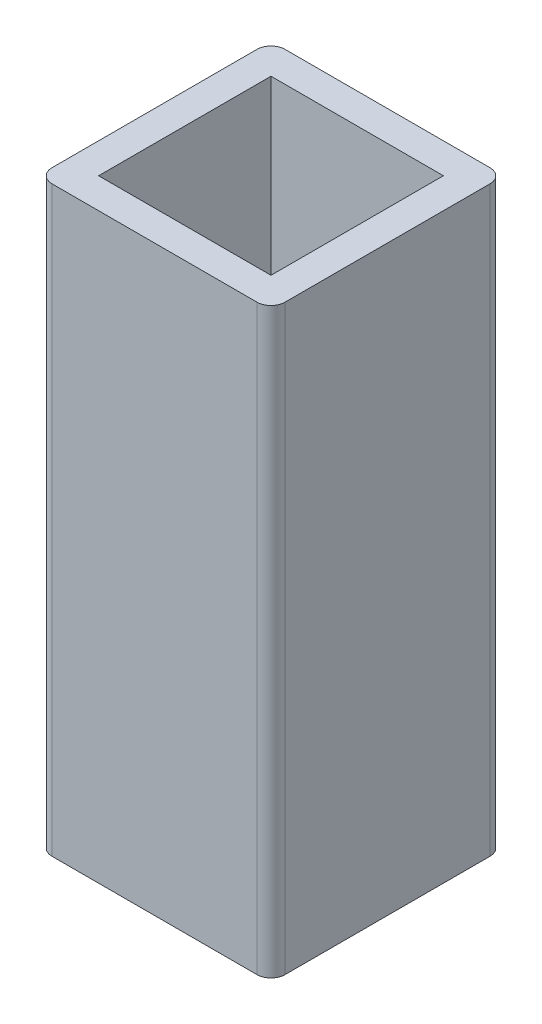
ISO-10303-21;
HEADER;
FILE_DESCRIPTION(('STEP AP214'),'2;1');
FILE_NAME('part.step','',(''),(''),'','','');
FILE_SCHEMA(('AUTOMOTIVE_DESIGN { 1 0 10303 214 1 1 1 1 }'));
ENDSEC;
DATA;
#1=APPLICATION_CONTEXT('core data for automotive mechanical design processes');
#2=APPLICATION_PROTOCOL_DEFINITION('international standard','automotive_design',2000,#1);
#3=PRODUCT_CONTEXT('',#1,'mechanical');
#4=PRODUCT('Part','Part','',(#3));
#5=PRODUCT_RELATED_PRODUCT_CATEGORY('part','',(#4));
#6=PRODUCT_DEFINITION_FORMATION('','',#4);
#7=PRODUCT_DEFINITION_CONTEXT('part definition',#1,'design');
#8=PRODUCT_DEFINITION('design','',#6,#7);
#9=PRODUCT_DEFINITION_SHAPE('','',#8);
#10=(LENGTH_UNIT() NAMED_UNIT(*) SI_UNIT(.MILLI.,.METRE.));
#11=(NAMED_UNIT(*) PLANE_ANGLE_UNIT() SI_UNIT($,.RADIAN.));
#12=(NAMED_UNIT(*) SI_UNIT($,.STERADIAN.) SOLID_ANGLE_UNIT());
#13=UNCERTAINTY_MEASURE_WITH_UNIT(LENGTH_MEASURE(1.E-05),#10,'distance_accuracy_value','');
#14=(GEOMETRIC_REPRESENTATION_CONTEXT(3) GLOBAL_UNCERTAINTY_ASSIGNED_CONTEXT((#13)) GLOBAL_UNIT_ASSIGNED_CONTEXT((#10,
#11,#12)) REPRESENTATION_CONTEXT('',''));
#15=CARTESIAN_POINT('',(0.,0.,0.));
#16=DIRECTION('',(0.,0.,1.));
#17=DIRECTION('',(1.,0.,0.));
#18=AXIS2_PLACEMENT_3D('',#15,#16,#17);
#19=CARTESIAN_POINT('',(-5.588,31.75,5.588));
#20=DIRECTION('',(0.,-1.,0.));
#21=DIRECTION('',(0.,0.,-1.));
#22=AXIS2_PLACEMENT_3D('',#19,#20,#21);
#23=PLANE('',#22);
#24=CARTESIAN_POINT('',(-5.588,31.75,5.588));
#25=DIRECTION('',(0.,1.,0.));
#26=DIRECTION('',(0.,0.,-1.));
#27=AXIS2_PLACEMENT_3D('',#24,#25,#26);
#28=CIRCLE('',#27,0.761999999999999);
#29=CARTESIAN_POINT('',(-6.35,31.75,5.588));
#30=VERTEX_POINT('',#29);
#31=CARTESIAN_POINT('',(-5.588,31.75,6.35));
#32=VERTEX_POINT('',#31);
#33=EDGE_CURVE('E168',#30,#32,#28,.T.);
#34=ORIENTED_EDGE('',*,*,#33,.T.);
#35=DIRECTION('',(1.,0.,0.));
#36=VECTOR('',#35,1.);
#37=CARTESIAN_POINT('',(-5.588,31.75,6.35));
#38=LINE('',#37,#36);
#39=CARTESIAN_POINT('',(5.588,31.75,6.35));
#40=VERTEX_POINT('',#39);
#41=EDGE_CURVE('E171',#32,#40,#38,.T.);
#42=ORIENTED_EDGE('',*,*,#41,.T.);
#43=CARTESIAN_POINT('',(5.588,31.75,5.588));
#44=DIRECTION('',(0.,1.,0.));
#45=DIRECTION('',(0.,0.,1.));
#46=AXIS2_PLACEMENT_3D('',#43,#44,#45);
#47=CIRCLE('',#46,0.761999999999999);
#48=CARTESIAN_POINT('',(6.35,31.75,5.588));
#49=VERTEX_POINT('',#48);
#50=EDGE_CURVE('E174',#40,#49,#47,.T.);
#51=ORIENTED_EDGE('',*,*,#50,.T.);
#52=DIRECTION('',(0.,0.,-1.));
#53=VECTOR('',#52,1.);
#54=CARTESIAN_POINT('',(6.35,31.75,5.588));
#55=LINE('',#54,#53);
#56=CARTESIAN_POINT('',(6.35,31.75,-5.588));
#57=VERTEX_POINT('',#56);
#58=EDGE_CURVE('E176',#49,#57,#55,.T.);
#59=ORIENTED_EDGE('',*,*,#58,.T.);
#60=CARTESIAN_POINT('',(5.588,31.75,-5.588));
#61=DIRECTION('',(0.,1.,0.));
#62=DIRECTION('',(0.,0.,-1.));
#63=AXIS2_PLACEMENT_3D('',#60,#61,#62);
#64=CIRCLE('',#63,0.761999999999999);
#65=CARTESIAN_POINT('',(5.588,31.75,-6.35));
#66=VERTEX_POINT('',#65);
#67=EDGE_CURVE('E178',#57,#66,#64,.T.);
#68=ORIENTED_EDGE('',*,*,#67,.T.);
#69=DIRECTION('',(-1.,0.,0.));
#70=VECTOR('',#69,1.);
#71=CARTESIAN_POINT('',(-5.588,31.75,-6.35));
#72=LINE('',#71,#70);
#73=CARTESIAN_POINT('',(-5.588,31.75,-6.35));
#74=VERTEX_POINT('',#73);
#75=EDGE_CURVE('E180',#66,#74,#72,.T.);
#76=ORIENTED_EDGE('',*,*,#75,.T.);
#77=CARTESIAN_POINT('',(-5.588,31.75,-5.588));
#78=DIRECTION('',(0.,1.,0.));
#79=DIRECTION('',(0.,0.,-1.));
#80=AXIS2_PLACEMENT_3D('',#77,#78,#79);
#81=CIRCLE('',#80,0.762000000000001);
#82=CARTESIAN_POINT('',(-6.35,31.75,-5.588));
#83=VERTEX_POINT('',#82);
#84=EDGE_CURVE('E182',#74,#83,#81,.T.);
#85=ORIENTED_EDGE('',*,*,#84,.T.);
#86=DIRECTION('',(0.,0.,1.));
#87=VECTOR('',#86,1.);
#88=CARTESIAN_POINT('',(-6.35,31.75,5.588));
#89=LINE('',#88,#87);
#90=EDGE_CURVE('E184',#83,#30,#89,.T.);
#91=ORIENTED_EDGE('',*,*,#90,.T.);
#92=EDGE_LOOP('',(#34,#42,#51,#59,#68,#76,#85,#91));
#93=FACE_BOUND('',#92,.T.);
#94=DIRECTION('',(1.,0.,0.));
#95=VECTOR('',#94,1.);
#96=CARTESIAN_POINT('',(-4.699,31.75,4.699));
#97=LINE('',#96,#95);
#98=CARTESIAN_POINT('',(-4.699,31.75,4.699));
#99=VERTEX_POINT('',#98);
#100=CARTESIAN_POINT('',(4.699,31.75,4.699));
#101=VERTEX_POINT('',#100);
#102=EDGE_CURVE('E132',#99,#101,#97,.T.);
#103=ORIENTED_EDGE('',*,*,#102,.F.);
#104=DIRECTION('',(0.,0.,1.));
#105=VECTOR('',#104,1.);
#106=CARTESIAN_POINT('',(-4.699,31.75,4.699));
#107=LINE('',#106,#105);
#108=CARTESIAN_POINT('',(-4.699,31.75,-4.699));
#109=VERTEX_POINT('',#108);
#110=EDGE_CURVE('E154',#109,#99,#107,.T.);
#111=ORIENTED_EDGE('',*,*,#110,.F.);
#112=DIRECTION('',(-1.,0.,0.));
#113=VECTOR('',#112,1.);
#114=CARTESIAN_POINT('',(-4.699,31.75,-4.699));
#115=LINE('',#114,#113);
#116=CARTESIAN_POINT('',(4.699,31.75,-4.699));
#117=VERTEX_POINT('',#116);
#118=EDGE_CURVE('E152',#117,#109,#115,.T.);
#119=ORIENTED_EDGE('',*,*,#118,.F.);
#120=DIRECTION('',(0.,0.,-1.));
#121=VECTOR('',#120,1.);
#122=CARTESIAN_POINT('',(4.699,31.75,4.699));
#123=LINE('',#122,#121);
#124=EDGE_CURVE('E140',#101,#117,#123,.T.);
#125=ORIENTED_EDGE('',*,*,#124,.F.);
#126=EDGE_LOOP('',(#103,#111,#119,#125));
#127=FACE_BOUND('',#126,.T.);
#128=ADVANCED_FACE('F43',(#93,#127),#23,.F.);
#129=CARTESIAN_POINT('',(-5.588,0.,5.588));
#130=DIRECTION('',(0.,-1.,0.));
#131=DIRECTION('',(0.,0.,-1.));
#132=AXIS2_PLACEMENT_3D('',#129,#130,#131);
#133=PLANE('',#132);
#134=CARTESIAN_POINT('',(-5.588,0.,5.588));
#135=DIRECTION('',(0.,1.,0.));
#136=DIRECTION('',(0.,0.,-1.));
#137=AXIS2_PLACEMENT_3D('',#134,#135,#136);
#138=CIRCLE('',#137,0.761999999999999);
#139=CARTESIAN_POINT('',(-6.35,0.,5.588));
#140=VERTEX_POINT('',#139);
#141=CARTESIAN_POINT('',(-5.588,0.,6.35));
#142=VERTEX_POINT('',#141);
#143=EDGE_CURVE('E148',#140,#142,#138,.T.);
#144=ORIENTED_EDGE('',*,*,#143,.F.);
#145=DIRECTION('',(0.,0.,1.));
#146=VECTOR('',#145,1.);
#147=CARTESIAN_POINT('',(-6.35,0.,5.588));
#148=LINE('',#147,#146);
#149=CARTESIAN_POINT('',(-6.35,0.,-5.588));
#150=VERTEX_POINT('',#149);
#151=EDGE_CURVE('E172',#150,#140,#148,.T.);
#152=ORIENTED_EDGE('',*,*,#151,.F.);
#153=CARTESIAN_POINT('',(-5.588,0.,-5.588));
#154=DIRECTION('',(0.,1.,0.));
#155=DIRECTION('',(0.,0.,-1.));
#156=AXIS2_PLACEMENT_3D('',#153,#154,#155);
#157=CIRCLE('',#156,0.762000000000001);
#158=CARTESIAN_POINT('',(-5.588,0.,-6.35));
#159=VERTEX_POINT('',#158);
#160=EDGE_CURVE('E199',#159,#150,#157,.T.);
#161=ORIENTED_EDGE('',*,*,#160,.F.);
#162=DIRECTION('',(-1.,0.,0.));
#163=VECTOR('',#162,1.);
#164=CARTESIAN_POINT('',(-5.588,0.,-6.35));
#165=LINE('',#164,#163);
#166=CARTESIAN_POINT('',(5.588,0.,-6.35));
#167=VERTEX_POINT('',#166);
#168=EDGE_CURVE('E197',#167,#159,#165,.T.);
#169=ORIENTED_EDGE('',*,*,#168,.F.);
#170=CARTESIAN_POINT('',(5.588,0.,-5.588));
#171=DIRECTION('',(0.,1.,0.));
#172=DIRECTION('',(0.,0.,-1.));
#173=AXIS2_PLACEMENT_3D('',#170,#171,#172);
#174=CIRCLE('',#173,0.761999999999999);
#175=CARTESIAN_POINT('',(6.35,0.,-5.588));
#176=VERTEX_POINT('',#175);
#177=EDGE_CURVE('E195',#176,#167,#174,.T.);
#178=ORIENTED_EDGE('',*,*,#177,.F.);
#179=DIRECTION('',(0.,0.,-1.));
#180=VECTOR('',#179,1.);
#181=CARTESIAN_POINT('',(6.35,0.,5.588));
#182=LINE('',#181,#180);
#183=CARTESIAN_POINT('',(6.35,0.,5.588));
#184=VERTEX_POINT('',#183);
#185=EDGE_CURVE('E193',#184,#176,#182,.T.);
#186=ORIENTED_EDGE('',*,*,#185,.F.);
#187=CARTESIAN_POINT('',(5.588,0.,5.588));
#188=DIRECTION('',(0.,1.,0.));
#189=DIRECTION('',(0.,0.,1.));
#190=AXIS2_PLACEMENT_3D('',#187,#188,#189);
#191=CIRCLE('',#190,0.761999999999999);
#192=CARTESIAN_POINT('',(5.588,0.,6.35));
#193=VERTEX_POINT('',#192);
#194=EDGE_CURVE('E191',#193,#184,#191,.T.);
#195=ORIENTED_EDGE('',*,*,#194,.F.);
#196=DIRECTION('',(1.,0.,0.));
#197=VECTOR('',#196,1.);
#198=CARTESIAN_POINT('',(-5.588,0.,6.35));
#199=LINE('',#198,#197);
#200=EDGE_CURVE('E189',#142,#193,#199,.T.);
#201=ORIENTED_EDGE('',*,*,#200,.F.);
#202=EDGE_LOOP('',(#144,#152,#161,#169,#178,#186,#195,#201));
#203=FACE_BOUND('',#202,.T.);
#204=DIRECTION('',(0.,0.,1.));
#205=VECTOR('',#204,1.);
#206=CARTESIAN_POINT('',(-4.699,0.,4.699));
#207=LINE('',#206,#205);
#208=CARTESIAN_POINT('',(-4.699,0.,-4.699));
#209=VERTEX_POINT('',#208);
#210=CARTESIAN_POINT('',(-4.699,0.,4.699));
#211=VERTEX_POINT('',#210);
#212=EDGE_CURVE('E141',#209,#211,#207,.T.);
#213=ORIENTED_EDGE('',*,*,#212,.T.);
#214=DIRECTION('',(1.,0.,0.));
#215=VECTOR('',#214,1.);
#216=CARTESIAN_POINT('',(-4.699,0.,4.699));
#217=LINE('',#216,#215);
#218=CARTESIAN_POINT('',(4.699,0.,4.699));
#219=VERTEX_POINT('',#218);
#220=EDGE_CURVE('E66',#211,#219,#217,.T.);
#221=ORIENTED_EDGE('',*,*,#220,.T.);
#222=DIRECTION('',(0.,0.,-1.));
#223=VECTOR('',#222,1.);
#224=CARTESIAN_POINT('',(4.699,0.,4.699));
#225=LINE('',#224,#223);
#226=CARTESIAN_POINT('',(4.699,0.,-4.699));
#227=VERTEX_POINT('',#226);
#228=EDGE_CURVE('E147',#219,#227,#225,.T.);
#229=ORIENTED_EDGE('',*,*,#228,.T.);
#230=DIRECTION('',(-1.,0.,0.));
#231=VECTOR('',#230,1.);
#232=CARTESIAN_POINT('',(-4.699,0.,-4.699));
#233=LINE('',#232,#231);
#234=EDGE_CURVE('E160',#227,#209,#233,.T.);
#235=ORIENTED_EDGE('',*,*,#234,.T.);
#236=EDGE_LOOP('',(#213,#221,#229,#235));
#237=FACE_BOUND('',#236,.T.);
#238=ADVANCED_FACE('F229',(#203,#237),#133,.T.);
#239=CARTESIAN_POINT('',(-5.588,31.75,5.588));
#240=DIRECTION('',(0.,-1.,0.));
#241=DIRECTION('',(0.,0.,-1.));
#242=AXIS2_PLACEMENT_3D('',#239,#240,#241);
#243=CYLINDRICAL_SURFACE('',#242,0.761999999999999);
#244=ORIENTED_EDGE('',*,*,#143,.T.);
#245=DIRECTION('',(0.,-1.,0.));
#246=VECTOR('',#245,1.);
#247=CARTESIAN_POINT('',(-5.588,31.75,6.35));
#248=LINE('',#247,#246);
#249=EDGE_CURVE('E11',#32,#142,#248,.T.);
#250=ORIENTED_EDGE('',*,*,#249,.F.);
#251=ORIENTED_EDGE('',*,*,#33,.F.);
#252=DIRECTION('',(0.,-1.,0.));
#253=VECTOR('',#252,1.);
#254=CARTESIAN_POINT('',(-6.35,31.75,5.588));
#255=LINE('',#254,#253);
#256=EDGE_CURVE('E186',#30,#140,#255,.T.);
#257=ORIENTED_EDGE('',*,*,#256,.T.);
#258=EDGE_LOOP('',(#244,#250,#251,#257));
#259=FACE_BOUND('',#258,.T.);
#260=ADVANCED_FACE('F45',(#259),#243,.T.);
#261=CARTESIAN_POINT('',(-5.588,31.75,6.35));
#262=DIRECTION('',(0.,0.,-1.));
#263=DIRECTION('',(-1.,0.,0.));
#264=AXIS2_PLACEMENT_3D('',#261,#262,#263);
#265=PLANE('',#264);
#266=ORIENTED_EDGE('',*,*,#200,.T.);
#267=DIRECTION('',(0.,-1.,0.));
#268=VECTOR('',#267,1.);
#269=CARTESIAN_POINT('',(5.588,31.75,6.35));
#270=LINE('',#269,#268);
#271=EDGE_CURVE('E51',#40,#193,#270,.T.);
#272=ORIENTED_EDGE('',*,*,#271,.F.);
#273=ORIENTED_EDGE('',*,*,#41,.F.);
#274=ORIENTED_EDGE('',*,*,#249,.T.);
#275=EDGE_LOOP('',(#266,#272,#273,#274));
#276=FACE_BOUND('',#275,.T.);
#277=ADVANCED_FACE('F246',(#276),#265,.F.);
#278=CARTESIAN_POINT('',(5.588,31.75,5.588));
#279=DIRECTION('',(0.,-1.,0.));
#280=DIRECTION('',(0.,0.,-1.));
#281=AXIS2_PLACEMENT_3D('',#278,#279,#280);
#282=CYLINDRICAL_SURFACE('',#281,0.761999999999999);
#283=ORIENTED_EDGE('',*,*,#194,.T.);
#284=DIRECTION('',(0.,-1.,0.));
#285=VECTOR('',#284,1.);
#286=CARTESIAN_POINT('',(6.35,31.75,5.588));
#287=LINE('',#286,#285);
#288=EDGE_CURVE('E216',#49,#184,#287,.T.);
#289=ORIENTED_EDGE('',*,*,#288,.F.);
#290=ORIENTED_EDGE('',*,*,#50,.F.);
#291=ORIENTED_EDGE('',*,*,#271,.T.);
#292=EDGE_LOOP('',(#283,#289,#290,#291));
#293=FACE_BOUND('',#292,.T.);
#294=ADVANCED_FACE('F223',(#293),#282,.T.);
#295=CARTESIAN_POINT('',(6.35,31.75,5.588));
#296=DIRECTION('',(-1.,0.,0.));
#297=DIRECTION('',(0.,0.,1.));
#298=AXIS2_PLACEMENT_3D('',#295,#296,#297);
#299=PLANE('',#298);
#300=ORIENTED_EDGE('',*,*,#185,.T.);
#301=DIRECTION('',(0.,-1.,0.));
#302=VECTOR('',#301,1.);
#303=CARTESIAN_POINT('',(6.35,31.75,-5.588));
#304=LINE('',#303,#302);
#305=EDGE_CURVE('E213',#57,#176,#304,.T.);
#306=ORIENTED_EDGE('',*,*,#305,.F.);
#307=ORIENTED_EDGE('',*,*,#58,.F.);
#308=ORIENTED_EDGE('',*,*,#288,.T.);
#309=EDGE_LOOP('',(#300,#306,#307,#308));
#310=FACE_BOUND('',#309,.T.);
#311=ADVANCED_FACE('F235',(#310),#299,.F.);
#312=CARTESIAN_POINT('',(5.588,31.75,-5.588));
#313=DIRECTION('',(0.,-1.,0.));
#314=DIRECTION('',(0.,0.,-1.));
#315=AXIS2_PLACEMENT_3D('',#312,#313,#314);
#316=CYLINDRICAL_SURFACE('',#315,0.761999999999999);
#317=ORIENTED_EDGE('',*,*,#177,.T.);
#318=DIRECTION('',(0.,-1.,0.));
#319=VECTOR('',#318,1.);
#320=CARTESIAN_POINT('',(5.588,31.75,-6.35));
#321=LINE('',#320,#319);
#322=EDGE_CURVE('E210',#66,#167,#321,.T.);
#323=ORIENTED_EDGE('',*,*,#322,.F.);
#324=ORIENTED_EDGE('',*,*,#67,.F.);
#325=ORIENTED_EDGE('',*,*,#305,.T.);
#326=EDGE_LOOP('',(#317,#323,#324,#325));
#327=FACE_BOUND('',#326,.T.);
#328=ADVANCED_FACE('F239',(#327),#316,.T.);
#329=CARTESIAN_POINT('',(-5.588,31.75,-6.35));
#330=DIRECTION('',(0.,0.,1.));
#331=DIRECTION('',(1.,0.,0.));
#332=AXIS2_PLACEMENT_3D('',#329,#330,#331);
#333=PLANE('',#332);
#334=ORIENTED_EDGE('',*,*,#168,.T.);
#335=DIRECTION('',(0.,-1.,0.));
#336=VECTOR('',#335,1.);
#337=CARTESIAN_POINT('',(-5.588,31.75,-6.35));
#338=LINE('',#337,#336);
#339=EDGE_CURVE('E207',#74,#159,#338,.T.);
#340=ORIENTED_EDGE('',*,*,#339,.F.);
#341=ORIENTED_EDGE('',*,*,#75,.F.);
#342=ORIENTED_EDGE('',*,*,#322,.T.);
#343=EDGE_LOOP('',(#334,#340,#341,#342));
#344=FACE_BOUND('',#343,.T.);
#345=ADVANCED_FACE('F259',(#344),#333,.F.);
#346=CARTESIAN_POINT('',(-5.588,31.75,-5.588));
#347=DIRECTION('',(0.,-1.,0.));
#348=DIRECTION('',(0.,0.,-1.));
#349=AXIS2_PLACEMENT_3D('',#346,#347,#348);
#350=CYLINDRICAL_SURFACE('',#349,0.762000000000001);
#351=ORIENTED_EDGE('',*,*,#160,.T.);
#352=DIRECTION('',(0.,-1.,0.));
#353=VECTOR('',#352,1.);
#354=CARTESIAN_POINT('',(-6.35,31.75,-5.588));
#355=LINE('',#354,#353);
#356=EDGE_CURVE('E204',#83,#150,#355,.T.);
#357=ORIENTED_EDGE('',*,*,#356,.F.);
#358=ORIENTED_EDGE('',*,*,#84,.F.);
#359=ORIENTED_EDGE('',*,*,#339,.T.);
#360=EDGE_LOOP('',(#351,#357,#358,#359));
#361=FACE_BOUND('',#360,.T.);
#362=ADVANCED_FACE('F257',(#361),#350,.T.);
#363=CARTESIAN_POINT('',(-6.35,31.75,5.588));
#364=DIRECTION('',(1.,0.,0.));
#365=DIRECTION('',(0.,0.,-1.));
#366=AXIS2_PLACEMENT_3D('',#363,#364,#365);
#367=PLANE('',#366);
#368=ORIENTED_EDGE('',*,*,#151,.T.);
#369=ORIENTED_EDGE('',*,*,#256,.F.);
#370=ORIENTED_EDGE('',*,*,#90,.F.);
#371=ORIENTED_EDGE('',*,*,#356,.T.);
#372=EDGE_LOOP('',(#368,#369,#370,#371));
#373=FACE_BOUND('',#372,.T.);
#374=ADVANCED_FACE('F252',(#373),#367,.F.);
#375=CARTESIAN_POINT('',(-4.699,31.75,4.699));
#376=DIRECTION('',(0.,0.,-1.));
#377=DIRECTION('',(-1.,0.,0.));
#378=AXIS2_PLACEMENT_3D('',#375,#376,#377);
#379=PLANE('',#378);
#380=ORIENTED_EDGE('',*,*,#220,.F.);
#381=DIRECTION('',(0.,-1.,0.));
#382=VECTOR('',#381,1.);
#383=CARTESIAN_POINT('',(-4.699,31.75,4.699));
#384=LINE('',#383,#382);
#385=EDGE_CURVE('E136',#99,#211,#384,.T.);
#386=ORIENTED_EDGE('',*,*,#385,.F.);
#387=ORIENTED_EDGE('',*,*,#102,.T.);
#388=DIRECTION('',(0.,-1.,0.));
#389=VECTOR('',#388,1.);
#390=CARTESIAN_POINT('',(4.699,31.75,4.699));
#391=LINE('',#390,#389);
#392=EDGE_CURVE('E135',#101,#219,#391,.T.);
#393=ORIENTED_EDGE('',*,*,#392,.T.);
#394=EDGE_LOOP('',(#380,#386,#387,#393));
#395=FACE_BOUND('',#394,.T.);
#396=ADVANCED_FACE('F134',(#395),#379,.T.);
#397=CARTESIAN_POINT('',(4.699,31.75,4.699));
#398=DIRECTION('',(-1.,0.,0.));
#399=DIRECTION('',(0.,0.,1.));
#400=AXIS2_PLACEMENT_3D('',#397,#398,#399);
#401=PLANE('',#400);
#402=ORIENTED_EDGE('',*,*,#228,.F.);
#403=ORIENTED_EDGE('',*,*,#392,.F.);
#404=ORIENTED_EDGE('',*,*,#124,.T.);
#405=DIRECTION('',(0.,-1.,0.));
#406=VECTOR('',#405,1.);
#407=CARTESIAN_POINT('',(4.699,31.75,-4.699));
#408=LINE('',#407,#406);
#409=EDGE_CURVE('E149',#117,#227,#408,.T.);
#410=ORIENTED_EDGE('',*,*,#409,.T.);
#411=EDGE_LOOP('',(#402,#403,#404,#410));
#412=FACE_BOUND('',#411,.T.);
#413=ADVANCED_FACE('F144',(#412),#401,.T.);
#414=CARTESIAN_POINT('',(-4.699,31.75,-4.699));
#415=DIRECTION('',(0.,0.,1.));
#416=DIRECTION('',(1.,0.,0.));
#417=AXIS2_PLACEMENT_3D('',#414,#415,#416);
#418=PLANE('',#417);
#419=ORIENTED_EDGE('',*,*,#234,.F.);
#420=ORIENTED_EDGE('',*,*,#409,.F.);
#421=ORIENTED_EDGE('',*,*,#118,.T.);
#422=DIRECTION('',(0.,-1.,0.));
#423=VECTOR('',#422,1.);
#424=CARTESIAN_POINT('',(-4.699,31.75,-4.699));
#425=LINE('',#424,#423);
#426=EDGE_CURVE('E58',#109,#209,#425,.T.);
#427=ORIENTED_EDGE('',*,*,#426,.T.);
#428=EDGE_LOOP('',(#419,#420,#421,#427));
#429=FACE_BOUND('',#428,.T.);
#430=ADVANCED_FACE('F284',(#429),#418,.T.);
#431=CARTESIAN_POINT('',(-4.699,31.75,4.699));
#432=DIRECTION('',(1.,0.,0.));
#433=DIRECTION('',(0.,0.,-1.));
#434=AXIS2_PLACEMENT_3D('',#431,#432,#433);
#435=PLANE('',#434);
#436=ORIENTED_EDGE('',*,*,#212,.F.);
#437=ORIENTED_EDGE('',*,*,#426,.F.);
#438=ORIENTED_EDGE('',*,*,#110,.T.);
#439=ORIENTED_EDGE('',*,*,#385,.T.);
#440=EDGE_LOOP('',(#436,#437,#438,#439));
#441=FACE_BOUND('',#440,.T.);
#442=ADVANCED_FACE('F288',(#441),#435,.T.);
#443=CLOSED_SHELL('',(#128,#238,#260,#277,#294,#311,#328,#345,#362,#374,#396,#413,#430,#442));
#444=MANIFOLD_SOLID_BREP('B2',#443);
#445=ADVANCED_BREP_SHAPE_REPRESENTATION('',(#18,#444),#14);
#446=SHAPE_DEFINITION_REPRESENTATION(#9,#445);
ENDSEC;
END-ISO-10303-21;
